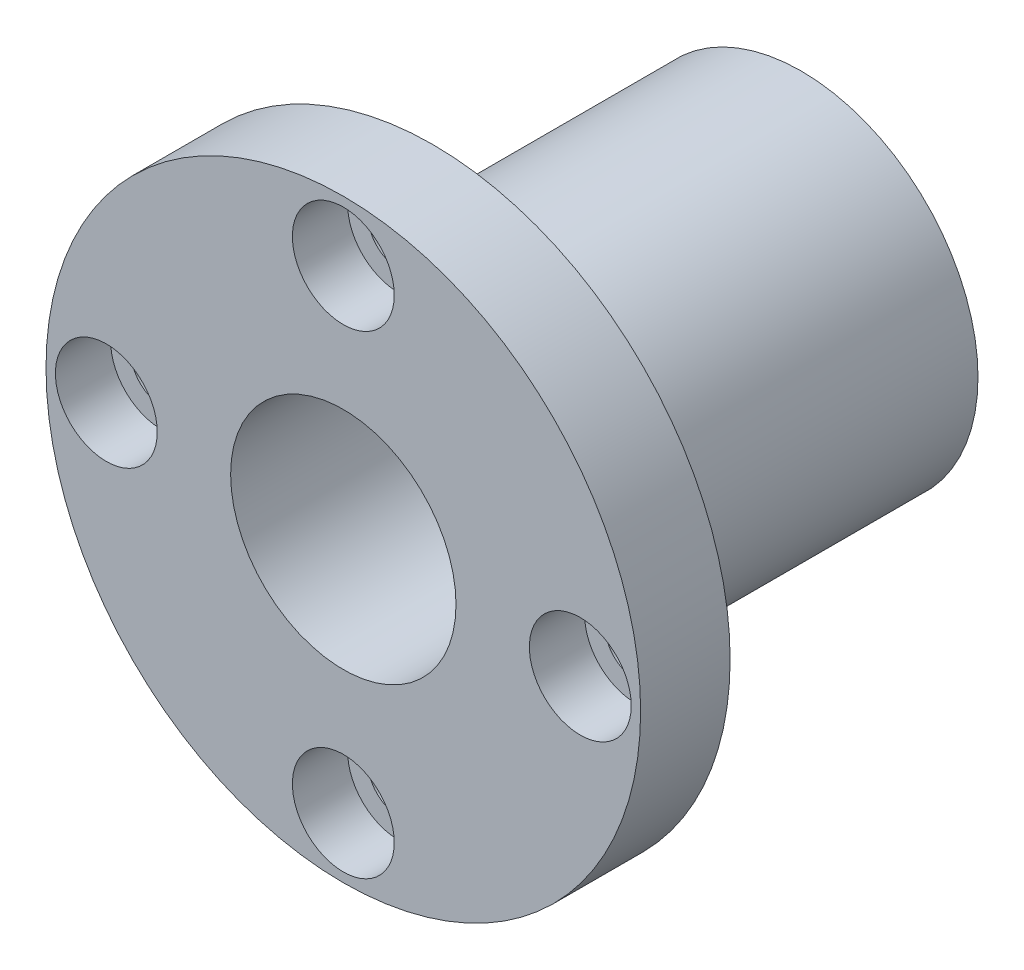
ISO-10303-21;
HEADER;
FILE_DESCRIPTION(('STEP AP214'),'2;1');
FILE_NAME('part.step','',(''),(''),'','','');
FILE_SCHEMA(('AUTOMOTIVE_DESIGN { 1 0 10303 214 1 1 1 1 }'));
ENDSEC;
DATA;
#1=APPLICATION_CONTEXT('core data for automotive mechanical design processes');
#2=APPLICATION_PROTOCOL_DEFINITION('international standard','automotive_design',2000,#1);
#3=PRODUCT_CONTEXT('',#1,'mechanical');
#4=PRODUCT('Part','Part','',(#3));
#5=PRODUCT_RELATED_PRODUCT_CATEGORY('part','',(#4));
#6=PRODUCT_DEFINITION_FORMATION('','',#4);
#7=PRODUCT_DEFINITION_CONTEXT('part definition',#1,'design');
#8=PRODUCT_DEFINITION('design','',#6,#7);
#9=PRODUCT_DEFINITION_SHAPE('','',#8);
#10=(LENGTH_UNIT() NAMED_UNIT(*) SI_UNIT(.MILLI.,.METRE.));
#11=(NAMED_UNIT(*) PLANE_ANGLE_UNIT() SI_UNIT($,.RADIAN.));
#12=(NAMED_UNIT(*) SI_UNIT($,.STERADIAN.) SOLID_ANGLE_UNIT());
#13=UNCERTAINTY_MEASURE_WITH_UNIT(LENGTH_MEASURE(1.E-05),#10,'distance_accuracy_value','');
#14=(GEOMETRIC_REPRESENTATION_CONTEXT(3) GLOBAL_UNCERTAINTY_ASSIGNED_CONTEXT((#13)) GLOBAL_UNIT_ASSIGNED_CONTEXT((#10,
#11,#12)) REPRESENTATION_CONTEXT('',''));
#15=CARTESIAN_POINT('',(0.,0.,0.));
#16=DIRECTION('',(0.,0.,1.));
#17=DIRECTION('',(1.,0.,0.));
#18=AXIS2_PLACEMENT_3D('',#15,#16,#17);
#19=CARTESIAN_POINT('',(0.,0.,33.35));
#20=DIRECTION('',(0.,0.,-1.));
#21=DIRECTION('',(-1.,0.,0.));
#22=AXIS2_PLACEMENT_3D('',#19,#20,#21);
#23=CYLINDRICAL_SURFACE('',#22,15.995);
#24=CARTESIAN_POINT('',(0.,0.,33.35));
#25=DIRECTION('',(0.,0.,1.));
#26=DIRECTION('',(1.,0.,0.));
#27=AXIS2_PLACEMENT_3D('',#24,#25,#26);
#28=CIRCLE('',#27,15.995);
#29=CARTESIAN_POINT('',(15.995,0.,33.35));
#30=VERTEX_POINT('',#29);
#31=EDGE_CURVE('E10',#30,#30,#28,.T.);
#32=ORIENTED_EDGE('',*,*,#31,.F.);
#33=EDGE_LOOP('',(#32));
#34=FACE_BOUND('',#33,.T.);
#35=CARTESIAN_POINT('',(0.,0.,0.));
#36=DIRECTION('',(0.,0.,1.));
#37=DIRECTION('',(1.,0.,0.));
#38=AXIS2_PLACEMENT_3D('',#35,#36,#37);
#39=CIRCLE('',#38,15.995);
#40=CARTESIAN_POINT('',(15.995,0.,0.));
#41=VERTEX_POINT('',#40);
#42=EDGE_CURVE('E37',#41,#41,#39,.T.);
#43=ORIENTED_EDGE('',*,*,#42,.T.);
#44=EDGE_LOOP('',(#43));
#45=FACE_BOUND('',#44,.T.);
#46=ADVANCED_FACE('F30',(#34,#45),#23,.T.);
#47=CARTESIAN_POINT('',(0.,0.,0.));
#48=DIRECTION('',(0.,0.,1.));
#49=DIRECTION('',(1.,0.,0.));
#50=AXIS2_PLACEMENT_3D('',#47,#48,#49);
#51=PLANE('',#50);
#52=CARTESIAN_POINT('',(0.,0.,0.));
#53=DIRECTION('',(0.,0.,1.));
#54=DIRECTION('',(1.,0.,0.));
#55=AXIS2_PLACEMENT_3D('',#52,#53,#54);
#56=CIRCLE('',#55,10.2);
#57=CARTESIAN_POINT('',(10.2,0.,0.));
#58=VERTEX_POINT('',#57);
#59=EDGE_CURVE('E323',#58,#58,#56,.F.);
#60=ORIENTED_EDGE('',*,*,#59,.F.);
#61=EDGE_LOOP('',(#60));
#62=FACE_BOUND('',#61,.T.);
#63=ORIENTED_EDGE('',*,*,#42,.F.);
#64=EDGE_LOOP('',(#63));
#65=FACE_BOUND('',#64,.T.);
#66=ADVANCED_FACE('F106',(#62,#65),#51,.F.);
#67=CARTESIAN_POINT('',(0.,0.,33.35));
#68=DIRECTION('',(0.,0.,1.));
#69=DIRECTION('',(1.,0.,0.));
#70=AXIS2_PLACEMENT_3D('',#67,#68,#69);
#71=PLANE('',#70);
#72=CARTESIAN_POINT('',(2.2534548130689E-13,21.45,33.35));
#73=DIRECTION('',(0.,0.,1.));
#74=DIRECTION('',(1.,0.,0.));
#75=AXIS2_PLACEMENT_3D('',#72,#73,#74);
#76=CIRCLE('',#75,2.755);
#77=CARTESIAN_POINT('',(2.75500000000022,21.45,33.35));
#78=VERTEX_POINT('',#77);
#79=EDGE_CURVE('E68',#78,#78,#76,.F.);
#80=ORIENTED_EDGE('',*,*,#79,.F.);
#81=EDGE_LOOP('',(#80));
#82=FACE_BOUND('',#81,.T.);
#83=CARTESIAN_POINT('',(-21.45,1.50453206588705E-13,33.35));
#84=DIRECTION('',(0.,0.,1.));
#85=DIRECTION('',(1.,0.,0.));
#86=AXIS2_PLACEMENT_3D('',#83,#84,#85);
#87=CIRCLE('',#86,2.755);
#88=CARTESIAN_POINT('',(-18.695,1.50453206588705E-13,33.35));
#89=VERTEX_POINT('',#88);
#90=EDGE_CURVE('E58',#89,#89,#87,.F.);
#91=ORIENTED_EDGE('',*,*,#90,.F.);
#92=EDGE_LOOP('',(#91));
#93=FACE_BOUND('',#92,.T.);
#94=CARTESIAN_POINT('',(0.,-21.45,33.35));
#95=DIRECTION('',(0.,0.,1.));
#96=DIRECTION('',(1.,0.,0.));
#97=AXIS2_PLACEMENT_3D('',#94,#95,#96);
#98=CIRCLE('',#97,2.755);
#99=CARTESIAN_POINT('',(2.75499999999992,-21.45,33.35));
#100=VERTEX_POINT('',#99);
#101=EDGE_CURVE('E55',#100,#100,#98,.F.);
#102=ORIENTED_EDGE('',*,*,#101,.F.);
#103=EDGE_LOOP('',(#102));
#104=FACE_BOUND('',#103,.T.);
#105=CARTESIAN_POINT('',(21.45,0.,33.35));
#106=DIRECTION('',(0.,0.,1.));
#107=DIRECTION('',(1.,0.,0.));
#108=AXIS2_PLACEMENT_3D('',#105,#106,#107);
#109=CIRCLE('',#108,2.755);
#110=CARTESIAN_POINT('',(24.205,0.,33.35));
#111=VERTEX_POINT('',#110);
#112=EDGE_CURVE('E52',#111,#111,#109,.F.);
#113=ORIENTED_EDGE('',*,*,#112,.F.);
#114=EDGE_LOOP('',(#113));
#115=FACE_BOUND('',#114,.T.);
#116=CARTESIAN_POINT('',(0.,0.,33.35));
#117=DIRECTION('',(0.,0.,1.));
#118=DIRECTION('',(1.,0.,0.));
#119=AXIS2_PLACEMENT_3D('',#116,#117,#118);
#120=CIRCLE('',#119,26.91);
#121=CARTESIAN_POINT('',(26.91,0.,33.35));
#122=VERTEX_POINT('',#121);
#123=EDGE_CURVE('E45',#122,#122,#120,.T.);
#124=ORIENTED_EDGE('',*,*,#123,.F.);
#125=EDGE_LOOP('',(#124));
#126=FACE_BOUND('',#125,.T.);
#127=ORIENTED_EDGE('',*,*,#31,.T.);
#128=EDGE_LOOP('',(#127));
#129=FACE_BOUND('',#128,.T.);
#130=ADVANCED_FACE('F104',(#82,#93,#104,#115,#126,#129),#71,.F.);
#131=CARTESIAN_POINT('',(0.,0.,41.45));
#132=DIRECTION('',(0.,0.,-1.));
#133=DIRECTION('',(-1.,0.,0.));
#134=AXIS2_PLACEMENT_3D('',#131,#132,#133);
#135=CYLINDRICAL_SURFACE('',#134,26.91);
#136=CARTESIAN_POINT('',(0.,0.,41.45));
#137=DIRECTION('',(0.,0.,1.));
#138=DIRECTION('',(1.,0.,0.));
#139=AXIS2_PLACEMENT_3D('',#136,#137,#138);
#140=CIRCLE('',#139,26.91);
#141=CARTESIAN_POINT('',(26.91,0.,41.45));
#142=VERTEX_POINT('',#141);
#143=EDGE_CURVE('E42',#142,#142,#140,.T.);
#144=ORIENTED_EDGE('',*,*,#143,.F.);
#145=EDGE_LOOP('',(#144));
#146=FACE_BOUND('',#145,.T.);
#147=ORIENTED_EDGE('',*,*,#123,.T.);
#148=EDGE_LOOP('',(#147));
#149=FACE_BOUND('',#148,.T.);
#150=ADVANCED_FACE('F102',(#146,#149),#135,.T.);
#151=CARTESIAN_POINT('',(0.,0.,41.45));
#152=DIRECTION('',(0.,0.,1.));
#153=DIRECTION('',(1.,0.,0.));
#154=AXIS2_PLACEMENT_3D('',#151,#152,#153);
#155=PLANE('',#154);
#156=CARTESIAN_POINT('',(0.,0.,41.45));
#157=DIRECTION('',(0.,0.,1.));
#158=DIRECTION('',(1.,0.,0.));
#159=AXIS2_PLACEMENT_3D('',#156,#157,#158);
#160=CIRCLE('',#159,10.2);
#161=CARTESIAN_POINT('',(10.2,0.,41.45));
#162=VERTEX_POINT('',#161);
#163=EDGE_CURVE('E325',#162,#162,#160,.T.);
#164=ORIENTED_EDGE('',*,*,#163,.F.);
#165=EDGE_LOOP('',(#164));
#166=FACE_BOUND('',#165,.T.);
#167=CARTESIAN_POINT('',(2.2534548130689E-13,21.45,41.45));
#168=DIRECTION('',(0.,0.,1.));
#169=DIRECTION('',(1.,0.,0.));
#170=AXIS2_PLACEMENT_3D('',#167,#168,#169);
#171=CIRCLE('',#170,4.61);
#172=CARTESIAN_POINT('',(4.61000000000023,21.45,41.45));
#173=VERTEX_POINT('',#172);
#174=EDGE_CURVE('E51',#173,#173,#171,.T.);
#175=ORIENTED_EDGE('',*,*,#174,.F.);
#176=EDGE_LOOP('',(#175));
#177=FACE_BOUND('',#176,.T.);
#178=CARTESIAN_POINT('',(-21.45,1.50453206588705E-13,41.45));
#179=DIRECTION('',(0.,0.,1.));
#180=DIRECTION('',(1.,0.,0.));
#181=AXIS2_PLACEMENT_3D('',#178,#179,#180);
#182=CIRCLE('',#181,4.61);
#183=CARTESIAN_POINT('',(-16.84,1.50453206588705E-13,41.45));
#184=VERTEX_POINT('',#183);
#185=EDGE_CURVE('E77',#184,#184,#182,.T.);
#186=ORIENTED_EDGE('',*,*,#185,.F.);
#187=EDGE_LOOP('',(#186));
#188=FACE_BOUND('',#187,.T.);
#189=CARTESIAN_POINT('',(0.,-21.45,41.45));
#190=DIRECTION('',(0.,0.,1.));
#191=DIRECTION('',(1.,0.,0.));
#192=AXIS2_PLACEMENT_3D('',#189,#190,#191);
#193=CIRCLE('',#192,4.61);
#194=CARTESIAN_POINT('',(4.60999999999992,-21.45,41.45));
#195=VERTEX_POINT('',#194);
#196=EDGE_CURVE('E83',#195,#195,#193,.T.);
#197=ORIENTED_EDGE('',*,*,#196,.F.);
#198=EDGE_LOOP('',(#197));
#199=FACE_BOUND('',#198,.T.);
#200=CARTESIAN_POINT('',(21.45,0.,41.45));
#201=DIRECTION('',(0.,0.,1.));
#202=DIRECTION('',(1.,0.,0.));
#203=AXIS2_PLACEMENT_3D('',#200,#201,#202);
#204=CIRCLE('',#203,4.61);
#205=CARTESIAN_POINT('',(26.06,0.,41.45));
#206=VERTEX_POINT('',#205);
#207=EDGE_CURVE('E89',#206,#206,#204,.T.);
#208=ORIENTED_EDGE('',*,*,#207,.F.);
#209=EDGE_LOOP('',(#208));
#210=FACE_BOUND('',#209,.T.);
#211=ORIENTED_EDGE('',*,*,#143,.T.);
#212=EDGE_LOOP('',(#211));
#213=FACE_BOUND('',#212,.T.);
#214=ADVANCED_FACE('F113',(#166,#177,#188,#199,#210,#213),#155,.T.);
#215=CARTESIAN_POINT('',(21.45,0.,36.45));
#216=DIRECTION('',(0.,0.,1.));
#217=DIRECTION('',(1.,0.,0.));
#218=AXIS2_PLACEMENT_3D('',#215,#216,#217);
#219=CYLINDRICAL_SURFACE('',#218,4.61);
#220=CARTESIAN_POINT('',(21.45,0.,36.45));
#221=DIRECTION('',(0.,0.,1.));
#222=DIRECTION('',(1.,0.,0.));
#223=AXIS2_PLACEMENT_3D('',#220,#221,#222);
#224=CIRCLE('',#223,4.61);
#225=CARTESIAN_POINT('',(26.06,0.,36.45));
#226=VERTEX_POINT('',#225);
#227=EDGE_CURVE('E92',#226,#226,#224,.T.);
#228=ORIENTED_EDGE('',*,*,#227,.F.);
#229=EDGE_LOOP('',(#228));
#230=FACE_BOUND('',#229,.T.);
#231=ORIENTED_EDGE('',*,*,#207,.T.);
#232=EDGE_LOOP('',(#231));
#233=FACE_BOUND('',#232,.T.);
#234=ADVANCED_FACE('F150',(#230,#233),#219,.F.);
#235=CARTESIAN_POINT('',(21.45,0.,36.45));
#236=DIRECTION('',(0.,0.,1.));
#237=DIRECTION('',(1.,0.,0.));
#238=AXIS2_PLACEMENT_3D('',#235,#236,#237);
#239=PLANE('',#238);
#240=CARTESIAN_POINT('',(21.45,0.,36.45));
#241=DIRECTION('',(0.,0.,1.));
#242=DIRECTION('',(1.,0.,0.));
#243=AXIS2_PLACEMENT_3D('',#240,#241,#242);
#244=CIRCLE('',#243,2.755);
#245=CARTESIAN_POINT('',(24.205,0.,36.45));
#246=VERTEX_POINT('',#245);
#247=EDGE_CURVE('E48',#246,#246,#244,.T.);
#248=ORIENTED_EDGE('',*,*,#247,.F.);
#249=EDGE_LOOP('',(#248));
#250=FACE_BOUND('',#249,.T.);
#251=ORIENTED_EDGE('',*,*,#227,.T.);
#252=EDGE_LOOP('',(#251));
#253=FACE_BOUND('',#252,.T.);
#254=ADVANCED_FACE('F238',(#250,#253),#239,.T.);
#255=CARTESIAN_POINT('',(0.,-21.45,36.45));
#256=DIRECTION('',(0.,0.,1.));
#257=DIRECTION('',(1.,0.,0.));
#258=AXIS2_PLACEMENT_3D('',#255,#256,#257);
#259=CYLINDRICAL_SURFACE('',#258,4.61);
#260=CARTESIAN_POINT('',(0.,-21.45,36.45));
#261=DIRECTION('',(0.,0.,1.));
#262=DIRECTION('',(1.,0.,0.));
#263=AXIS2_PLACEMENT_3D('',#260,#261,#262);
#264=CIRCLE('',#263,4.61);
#265=CARTESIAN_POINT('',(4.60999999999992,-21.45,36.45));
#266=VERTEX_POINT('',#265);
#267=EDGE_CURVE('E86',#266,#266,#264,.T.);
#268=ORIENTED_EDGE('',*,*,#267,.F.);
#269=EDGE_LOOP('',(#268));
#270=FACE_BOUND('',#269,.T.);
#271=ORIENTED_EDGE('',*,*,#196,.T.);
#272=EDGE_LOOP('',(#271));
#273=FACE_BOUND('',#272,.T.);
#274=ADVANCED_FACE('F230',(#270,#273),#259,.F.);
#275=CARTESIAN_POINT('',(0.,-21.45,36.45));
#276=DIRECTION('',(0.,0.,1.));
#277=DIRECTION('',(1.,0.,0.));
#278=AXIS2_PLACEMENT_3D('',#275,#276,#277);
#279=PLANE('',#278);
#280=CARTESIAN_POINT('',(0.,-21.45,36.45));
#281=DIRECTION('',(0.,0.,1.));
#282=DIRECTION('',(1.,0.,0.));
#283=AXIS2_PLACEMENT_3D('',#280,#281,#282);
#284=CIRCLE('',#283,2.755);
#285=CARTESIAN_POINT('',(2.75499999999992,-21.45,36.45));
#286=VERTEX_POINT('',#285);
#287=EDGE_CURVE('E53',#286,#286,#284,.T.);
#288=ORIENTED_EDGE('',*,*,#287,.F.);
#289=EDGE_LOOP('',(#288));
#290=FACE_BOUND('',#289,.T.);
#291=ORIENTED_EDGE('',*,*,#267,.T.);
#292=EDGE_LOOP('',(#291));
#293=FACE_BOUND('',#292,.T.);
#294=ADVANCED_FACE('F222',(#290,#293),#279,.T.);
#295=CARTESIAN_POINT('',(-21.45,1.50453206588705E-13,36.45));
#296=DIRECTION('',(0.,0.,1.));
#297=DIRECTION('',(1.,0.,0.));
#298=AXIS2_PLACEMENT_3D('',#295,#296,#297);
#299=CYLINDRICAL_SURFACE('',#298,4.61);
#300=CARTESIAN_POINT('',(-21.45,1.50453206588705E-13,36.45));
#301=DIRECTION('',(0.,0.,1.));
#302=DIRECTION('',(1.,0.,0.));
#303=AXIS2_PLACEMENT_3D('',#300,#301,#302);
#304=CIRCLE('',#303,4.61);
#305=CARTESIAN_POINT('',(-16.84,1.50453206588705E-13,36.45));
#306=VERTEX_POINT('',#305);
#307=EDGE_CURVE('E80',#306,#306,#304,.T.);
#308=ORIENTED_EDGE('',*,*,#307,.F.);
#309=EDGE_LOOP('',(#308));
#310=FACE_BOUND('',#309,.T.);
#311=ORIENTED_EDGE('',*,*,#185,.T.);
#312=EDGE_LOOP('',(#311));
#313=FACE_BOUND('',#312,.T.);
#314=ADVANCED_FACE('F214',(#310,#313),#299,.F.);
#315=CARTESIAN_POINT('',(-21.45,1.50453206588705E-13,36.45));
#316=DIRECTION('',(0.,0.,1.));
#317=DIRECTION('',(1.,0.,0.));
#318=AXIS2_PLACEMENT_3D('',#315,#316,#317);
#319=PLANE('',#318);
#320=CARTESIAN_POINT('',(-21.45,1.50453206588705E-13,36.45));
#321=DIRECTION('',(0.,0.,1.));
#322=DIRECTION('',(1.,0.,0.));
#323=AXIS2_PLACEMENT_3D('',#320,#321,#322);
#324=CIRCLE('',#323,2.755);
#325=CARTESIAN_POINT('',(-18.695,1.50453206588705E-13,36.45));
#326=VERTEX_POINT('',#325);
#327=EDGE_CURVE('E56',#326,#326,#324,.T.);
#328=ORIENTED_EDGE('',*,*,#327,.F.);
#329=EDGE_LOOP('',(#328));
#330=FACE_BOUND('',#329,.T.);
#331=ORIENTED_EDGE('',*,*,#307,.T.);
#332=EDGE_LOOP('',(#331));
#333=FACE_BOUND('',#332,.T.);
#334=ADVANCED_FACE('F205',(#330,#333),#319,.T.);
#335=CARTESIAN_POINT('',(2.2534548130689E-13,21.45,36.45));
#336=DIRECTION('',(0.,0.,1.));
#337=DIRECTION('',(1.,0.,0.));
#338=AXIS2_PLACEMENT_3D('',#335,#336,#337);
#339=CYLINDRICAL_SURFACE('',#338,4.61);
#340=CARTESIAN_POINT('',(2.2534548130689E-13,21.45,36.45));
#341=DIRECTION('',(0.,0.,1.));
#342=DIRECTION('',(1.,0.,0.));
#343=AXIS2_PLACEMENT_3D('',#340,#341,#342);
#344=CIRCLE('',#343,4.61);
#345=CARTESIAN_POINT('',(4.61000000000023,21.45,36.45));
#346=VERTEX_POINT('',#345);
#347=EDGE_CURVE('E74',#346,#346,#344,.T.);
#348=ORIENTED_EDGE('',*,*,#347,.F.);
#349=EDGE_LOOP('',(#348));
#350=FACE_BOUND('',#349,.T.);
#351=ORIENTED_EDGE('',*,*,#174,.T.);
#352=EDGE_LOOP('',(#351));
#353=FACE_BOUND('',#352,.T.);
#354=ADVANCED_FACE('F196',(#350,#353),#339,.F.);
#355=CARTESIAN_POINT('',(2.2534548130689E-13,21.45,36.45));
#356=DIRECTION('',(0.,0.,1.));
#357=DIRECTION('',(1.,0.,0.));
#358=AXIS2_PLACEMENT_3D('',#355,#356,#357);
#359=PLANE('',#358);
#360=CARTESIAN_POINT('',(2.2534548130689E-13,21.45,36.45));
#361=DIRECTION('',(0.,0.,1.));
#362=DIRECTION('',(1.,0.,0.));
#363=AXIS2_PLACEMENT_3D('',#360,#361,#362);
#364=CIRCLE('',#363,2.755);
#365=CARTESIAN_POINT('',(2.75500000000022,21.45,36.45));
#366=VERTEX_POINT('',#365);
#367=EDGE_CURVE('E33',#366,#366,#364,.T.);
#368=ORIENTED_EDGE('',*,*,#367,.F.);
#369=EDGE_LOOP('',(#368));
#370=FACE_BOUND('',#369,.T.);
#371=ORIENTED_EDGE('',*,*,#347,.T.);
#372=EDGE_LOOP('',(#371));
#373=FACE_BOUND('',#372,.T.);
#374=ADVANCED_FACE('F188',(#370,#373),#359,.T.);
#375=CARTESIAN_POINT('',(21.45,0.,25.5576832713242));
#376=DIRECTION('',(0.,0.,1.));
#377=DIRECTION('',(1.,0.,0.));
#378=AXIS2_PLACEMENT_3D('',#375,#376,#377);
#379=CYLINDRICAL_SURFACE('',#378,2.755);
#380=ORIENTED_EDGE('',*,*,#247,.T.);
#381=EDGE_LOOP('',(#380));
#382=FACE_BOUND('',#381,.T.);
#383=ORIENTED_EDGE('',*,*,#112,.T.);
#384=EDGE_LOOP('',(#383));
#385=FACE_BOUND('',#384,.T.);
#386=ADVANCED_FACE('F180',(#382,#385),#379,.F.);
#387=CARTESIAN_POINT('',(0.,-21.45,25.5576832713242));
#388=DIRECTION('',(0.,0.,1.));
#389=DIRECTION('',(1.,0.,0.));
#390=AXIS2_PLACEMENT_3D('',#387,#388,#389);
#391=CYLINDRICAL_SURFACE('',#390,2.755);
#392=ORIENTED_EDGE('',*,*,#287,.T.);
#393=EDGE_LOOP('',(#392));
#394=FACE_BOUND('',#393,.T.);
#395=ORIENTED_EDGE('',*,*,#101,.T.);
#396=EDGE_LOOP('',(#395));
#397=FACE_BOUND('',#396,.T.);
#398=ADVANCED_FACE('F173',(#394,#397),#391,.F.);
#399=CARTESIAN_POINT('',(-21.45,1.50453206588705E-13,25.5576832713242));
#400=DIRECTION('',(0.,0.,1.));
#401=DIRECTION('',(1.,0.,0.));
#402=AXIS2_PLACEMENT_3D('',#399,#400,#401);
#403=CYLINDRICAL_SURFACE('',#402,2.755);
#404=ORIENTED_EDGE('',*,*,#327,.T.);
#405=EDGE_LOOP('',(#404));
#406=FACE_BOUND('',#405,.T.);
#407=ORIENTED_EDGE('',*,*,#90,.T.);
#408=EDGE_LOOP('',(#407));
#409=FACE_BOUND('',#408,.T.);
#410=ADVANCED_FACE('F168',(#406,#409),#403,.F.);
#411=CARTESIAN_POINT('',(2.2534548130689E-13,21.45,25.5576832713242));
#412=DIRECTION('',(0.,0.,1.));
#413=DIRECTION('',(1.,0.,0.));
#414=AXIS2_PLACEMENT_3D('',#411,#412,#413);
#415=CYLINDRICAL_SURFACE('',#414,2.755);
#416=ORIENTED_EDGE('',*,*,#367,.T.);
#417=EDGE_LOOP('',(#416));
#418=FACE_BOUND('',#417,.T.);
#419=ORIENTED_EDGE('',*,*,#79,.T.);
#420=EDGE_LOOP('',(#419));
#421=FACE_BOUND('',#420,.T.);
#422=ADVANCED_FACE('F140',(#418,#421),#415,.F.);
#423=CARTESIAN_POINT('',(0.,0.,-28.8499566724111));
#424=DIRECTION('',(0.,0.,1.));
#425=DIRECTION('',(1.,0.,0.));
#426=AXIS2_PLACEMENT_3D('',#423,#424,#425);
#427=CYLINDRICAL_SURFACE('',#426,10.2);
#428=ORIENTED_EDGE('',*,*,#59,.T.);
#429=EDGE_LOOP('',(#428));
#430=FACE_BOUND('',#429,.T.);
#431=ORIENTED_EDGE('',*,*,#163,.T.);
#432=EDGE_LOOP('',(#431));
#433=FACE_BOUND('',#432,.T.);
#434=ADVANCED_FACE('F157',(#430,#433),#427,.F.);
#435=CLOSED_SHELL('',(#46,#66,#130,#150,#214,#234,#254,#274,#294,#314,#334,#354,#374,#386,#398,
#410,#422,#434));
#436=MANIFOLD_SOLID_BREP('B2',#435);
#437=ADVANCED_BREP_SHAPE_REPRESENTATION('',(#18,#436),#14);
#438=SHAPE_DEFINITION_REPRESENTATION(#9,#437);
ENDSEC;
END-ISO-10303-21;
